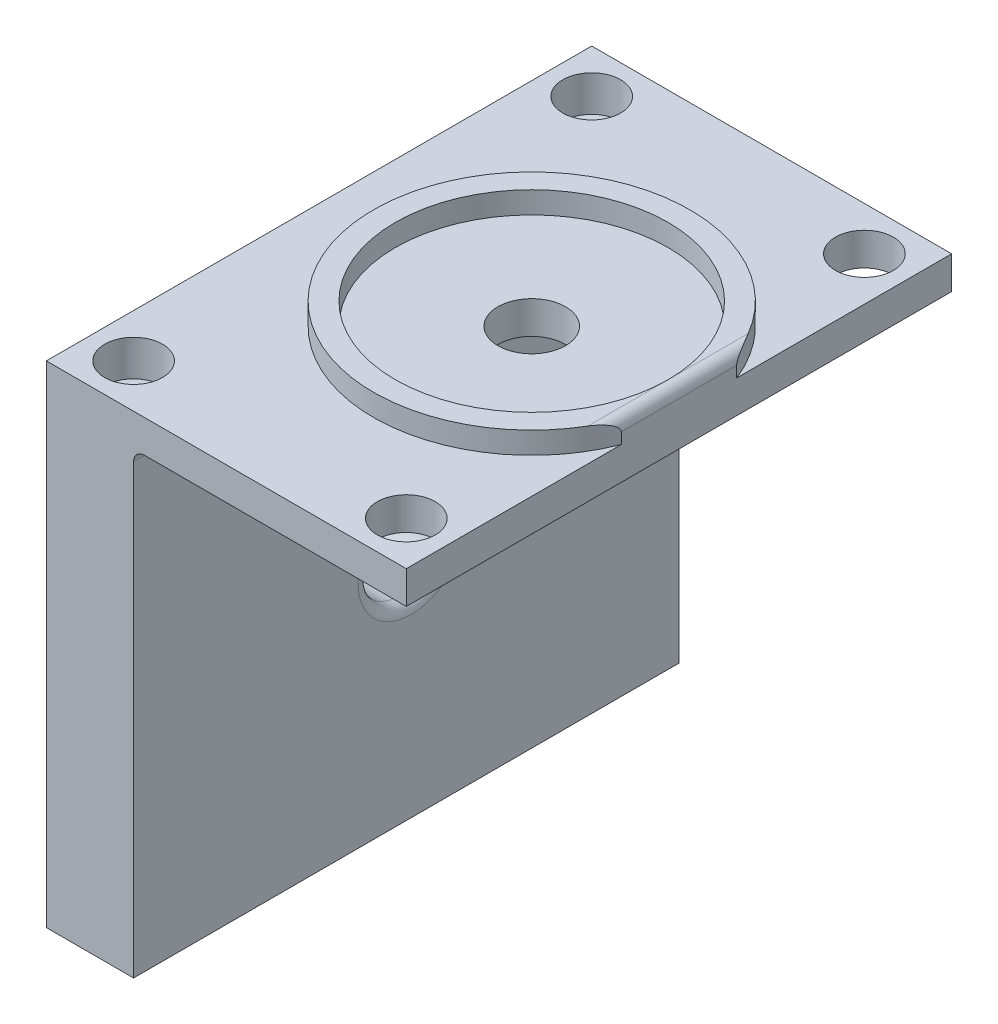
ISO-10303-21;
HEADER;
FILE_DESCRIPTION(('STEP AP214'),'2;1');
FILE_NAME('part.step','',(''),(''),'','','');
FILE_SCHEMA(('AUTOMOTIVE_DESIGN { 1 0 10303 214 1 1 1 1 }'));
ENDSEC;
DATA;
#1=APPLICATION_CONTEXT('core data for automotive mechanical design processes');
#2=APPLICATION_PROTOCOL_DEFINITION('international standard','automotive_design',2000,#1);
#3=PRODUCT_CONTEXT('',#1,'mechanical');
#4=PRODUCT('Part','Part','',(#3));
#5=PRODUCT_RELATED_PRODUCT_CATEGORY('part','',(#4));
#6=PRODUCT_DEFINITION_FORMATION('','',#4);
#7=PRODUCT_DEFINITION_CONTEXT('part definition',#1,'design');
#8=PRODUCT_DEFINITION('design','',#6,#7);
#9=PRODUCT_DEFINITION_SHAPE('','',#8);
#10=(LENGTH_UNIT() NAMED_UNIT(*) SI_UNIT(.MILLI.,.METRE.));
#11=(NAMED_UNIT(*) PLANE_ANGLE_UNIT() SI_UNIT($,.RADIAN.));
#12=(NAMED_UNIT(*) SI_UNIT($,.STERADIAN.) SOLID_ANGLE_UNIT());
#13=UNCERTAINTY_MEASURE_WITH_UNIT(LENGTH_MEASURE(1.E-05),#10,'distance_accuracy_value','');
#14=(GEOMETRIC_REPRESENTATION_CONTEXT(3) GLOBAL_UNCERTAINTY_ASSIGNED_CONTEXT((#13)) GLOBAL_UNIT_ASSIGNED_CONTEXT((#10,
#11,#12)) REPRESENTATION_CONTEXT('',''));
#15=CARTESIAN_POINT('',(0.,0.,0.));
#16=DIRECTION('',(0.,0.,1.));
#17=DIRECTION('',(1.,0.,0.));
#18=AXIS2_PLACEMENT_3D('',#15,#16,#17);
#19=CARTESIAN_POINT('',(0.,3.,0.));
#20=DIRECTION('',(0.,1.,0.));
#21=DIRECTION('',(0.,0.,1.));
#22=AXIS2_PLACEMENT_3D('',#19,#20,#21);
#23=PLANE('',#22);
#24=CARTESIAN_POINT('',(1.27695167286245,3.,-11.3847583643123));
#25=DIRECTION('',(0.,1.,0.));
#26=DIRECTION('',(0.,0.,1.));
#27=AXIS2_PLACEMENT_3D('',#24,#25,#26);
#28=CIRCLE('',#27,3.1);
#29=CARTESIAN_POINT('',(1.27695167286245,3.,-8.28475836431227));
#30=VERTEX_POINT('',#29);
#31=EDGE_CURVE('E244',#30,#30,#28,.T.);
#32=ORIENTED_EDGE('',*,*,#31,.F.);
#33=EDGE_LOOP('',(#32));
#34=FACE_BOUND('',#33,.T.);
#35=CARTESIAN_POINT('',(1.27695167286245,3.,-11.3847583643123));
#36=DIRECTION('',(0.,1.,0.));
#37=DIRECTION('',(0.,0.,1.));
#38=AXIS2_PLACEMENT_3D('',#35,#36,#37);
#39=CIRCLE('',#38,12.5);
#40=CARTESIAN_POINT('',(1.27695167286245,3.,1.11524163568773));
#41=VERTEX_POINT('',#40);
#42=EDGE_CURVE('E146',#41,#41,#39,.T.);
#43=ORIENTED_EDGE('',*,*,#42,.T.);
#44=EDGE_LOOP('',(#43));
#45=FACE_BOUND('',#44,.T.);
#46=ADVANCED_FACE('F41',(#34,#45),#23,.T.);
#47=CARTESIAN_POINT('',(0.,0.,0.));
#48=DIRECTION('',(0.,1.,0.));
#49=DIRECTION('',(0.,0.,1.));
#50=AXIS2_PLACEMENT_3D('',#47,#48,#49);
#51=PLANE('',#50);
#52=CARTESIAN_POINT('',(10.7769516728624,0.,-32.3847583643123));
#53=DIRECTION('',(0.,1.,0.));
#54=DIRECTION('',(0.,0.,1.));
#55=AXIS2_PLACEMENT_3D('',#52,#53,#54);
#56=CIRCLE('',#55,2.65);
#57=CARTESIAN_POINT('',(10.7769516728624,0.,-29.7347583643123));
#58=VERTEX_POINT('',#57);
#59=EDGE_CURVE('E170',#58,#58,#56,.F.);
#60=ORIENTED_EDGE('',*,*,#59,.F.);
#61=EDGE_LOOP('',(#60));
#62=FACE_BOUND('',#61,.T.);
#63=CARTESIAN_POINT('',(10.7769516728625,0.,9.61524163568773));
#64=DIRECTION('',(0.,1.,0.));
#65=DIRECTION('',(0.,0.,1.));
#66=AXIS2_PLACEMENT_3D('',#63,#64,#65);
#67=CIRCLE('',#66,2.65);
#68=CARTESIAN_POINT('',(10.7769516728625,0.,12.2652416356877));
#69=VERTEX_POINT('',#68);
#70=EDGE_CURVE('E163',#69,#69,#67,.F.);
#71=ORIENTED_EDGE('',*,*,#70,.F.);
#72=EDGE_LOOP('',(#71));
#73=FACE_BOUND('',#72,.T.);
#74=CARTESIAN_POINT('',(1.27695167286245,0.,-11.3847583643123));
#75=DIRECTION('',(0.,1.,0.));
#76=DIRECTION('',(0.,0.,1.));
#77=AXIS2_PLACEMENT_3D('',#74,#75,#76);
#78=CIRCLE('',#77,3.1);
#79=CARTESIAN_POINT('',(1.27695167286245,0.,-8.28475836431227));
#80=VERTEX_POINT('',#79);
#81=EDGE_CURVE('E243',#80,#80,#78,.T.);
#82=ORIENTED_EDGE('',*,*,#81,.T.);
#83=EDGE_LOOP('',(#82));
#84=FACE_BOUND('',#83,.T.);
#85=DIRECTION('',(1.,0.,0.));
#86=VECTOR('',#85,1.);
#87=CARTESIAN_POINT('',(-10.2230483271375,0.,13.6152416356877));
#88=LINE('',#87,#86);
#89=CARTESIAN_POINT('',(-9.22304832713755,0.,13.6152416356877));
#90=VERTEX_POINT('',#89);
#91=CARTESIAN_POINT('',(14.7769516728625,0.,13.6152416356877));
#92=VERTEX_POINT('',#91);
#93=EDGE_CURVE('E248',#90,#92,#88,.T.);
#94=ORIENTED_EDGE('',*,*,#93,.F.);
#95=DIRECTION('',(0.,0.,1.));
#96=VECTOR('',#95,1.);
#97=CARTESIAN_POINT('',(-9.22304832713755,0.,-36.3847583643123));
#98=LINE('',#97,#96);
#99=CARTESIAN_POINT('',(-9.22304832713755,0.,-36.3847583643123));
#100=VERTEX_POINT('',#99);
#101=EDGE_CURVE('E284',#90,#100,#98,.F.);
#102=ORIENTED_EDGE('',*,*,#101,.T.);
#103=DIRECTION('',(-1.,0.,0.));
#104=VECTOR('',#103,1.);
#105=CARTESIAN_POINT('',(-10.2230483271376,0.,-36.3847583643123));
#106=LINE('',#105,#104);
#107=CARTESIAN_POINT('',(14.7769516728625,0.,-36.3847583643123));
#108=VERTEX_POINT('',#107);
#109=EDGE_CURVE('E253',#108,#100,#106,.T.);
#110=ORIENTED_EDGE('',*,*,#109,.F.);
#111=DIRECTION('',(0.,0.,-1.));
#112=VECTOR('',#111,1.);
#113=CARTESIAN_POINT('',(14.7769516728625,0.,-36.3847583643123));
#114=LINE('',#113,#112);
#115=EDGE_CURVE('E260',#92,#108,#114,.T.);
#116=ORIENTED_EDGE('',*,*,#115,.F.);
#117=EDGE_LOOP('',(#94,#102,#110,#116));
#118=FACE_BOUND('',#117,.T.);
#119=ADVANCED_FACE('F386',(#62,#73,#84,#118),#51,.F.);
#120=CARTESIAN_POINT('',(1.27695167286245,3.,-11.3847583643123));
#121=DIRECTION('',(0.,1.,0.));
#122=DIRECTION('',(0.,0.,1.));
#123=AXIS2_PLACEMENT_3D('',#120,#121,#122);
#124=CIRCLE('',#123,14.5);
#125=CARTESIAN_POINT('',(14.7769516728625,3.,-16.6762609864415));
#126=VERTEX_POINT('',#125);
#127=CARTESIAN_POINT('',(14.7769516728625,3.,-6.0932557421831));
#128=VERTEX_POINT('',#127);
#129=EDGE_CURVE('E134',#126,#128,#124,.T.);
#130=ORIENTED_EDGE('',*,*,#129,.F.);
#131=DIRECTION('',(0.,0.,-1.));
#132=VECTOR('',#131,1.);
#133=CARTESIAN_POINT('',(14.7769516728625,3.,-36.3847583643123));
#134=LINE('',#133,#132);
#135=CARTESIAN_POINT('',(14.7769516728625,3.,-36.3847583643123));
#136=VERTEX_POINT('',#135);
#137=EDGE_CURVE('E141',#126,#136,#134,.T.);
#138=ORIENTED_EDGE('',*,*,#137,.T.);
#139=DIRECTION('',(-1.,0.,0.));
#140=VECTOR('',#139,1.);
#141=CARTESIAN_POINT('',(-10.2230483271376,3.,-36.3847583643123));
#142=LINE('',#141,#140);
#143=CARTESIAN_POINT('',(-18.2230483271376,3.,-36.3847583643123));
#144=VERTEX_POINT('',#143);
#145=EDGE_CURVE('E140',#136,#144,#142,.T.);
#146=ORIENTED_EDGE('',*,*,#145,.T.);
#147=DIRECTION('',(0.,0.,-1.));
#148=VECTOR('',#147,1.);
#149=CARTESIAN_POINT('',(-18.2230483271376,3.,-36.3847583643123));
#150=LINE('',#149,#148);
#151=CARTESIAN_POINT('',(-18.2230483271375,3.,13.6152416356877));
#152=VERTEX_POINT('',#151);
#153=EDGE_CURVE('E239',#152,#144,#150,.T.);
#154=ORIENTED_EDGE('',*,*,#153,.F.);
#155=DIRECTION('',(1.,0.,0.));
#156=VECTOR('',#155,1.);
#157=CARTESIAN_POINT('',(-10.2230483271375,3.,13.6152416356877));
#158=LINE('',#157,#156);
#159=CARTESIAN_POINT('',(14.7769516728625,3.,13.6152416356877));
#160=VERTEX_POINT('',#159);
#161=EDGE_CURVE('E137',#152,#160,#158,.T.);
#162=ORIENTED_EDGE('',*,*,#161,.T.);
#163=EDGE_CURVE('E123',#160,#128,#134,.T.);
#164=ORIENTED_EDGE('',*,*,#163,.T.);
#165=EDGE_LOOP('',(#130,#138,#146,#154,#162,#164));
#166=FACE_BOUND('',#165,.T.);
#167=CARTESIAN_POINT('',(10.7769516728624,3.,-32.3847583643123));
#168=DIRECTION('',(0.,-1.,0.));
#169=DIRECTION('',(0.,0.,1.));
#170=AXIS2_PLACEMENT_3D('',#167,#168,#169);
#171=CIRCLE('',#170,2.65);
#172=CARTESIAN_POINT('',(10.7769516728624,3.,-29.7347583643123));
#173=VERTEX_POINT('',#172);
#174=EDGE_CURVE('E159',#173,#173,#171,.T.);
#175=ORIENTED_EDGE('',*,*,#174,.T.);
#176=EDGE_LOOP('',(#175));
#177=FACE_BOUND('',#176,.T.);
#178=CARTESIAN_POINT('',(10.7769516728625,3.,9.61524163568773));
#179=DIRECTION('',(0.,-1.,0.));
#180=DIRECTION('',(0.,0.,1.));
#181=AXIS2_PLACEMENT_3D('',#178,#179,#180);
#182=CIRCLE('',#181,2.65);
#183=CARTESIAN_POINT('',(10.7769516728625,3.,12.2652416356877));
#184=VERTEX_POINT('',#183);
#185=EDGE_CURVE('E158',#184,#184,#182,.T.);
#186=ORIENTED_EDGE('',*,*,#185,.T.);
#187=EDGE_LOOP('',(#186));
#188=FACE_BOUND('',#187,.T.);
#189=CARTESIAN_POINT('',(-14.2230483271375,3.,-32.3847583643123));
#190=DIRECTION('',(0.,1.,0.));
#191=DIRECTION('',(0.,0.,1.));
#192=AXIS2_PLACEMENT_3D('',#189,#190,#191);
#193=CIRCLE('',#192,2.65);
#194=CARTESIAN_POINT('',(-14.2230483271375,3.,-29.7347583643123));
#195=VERTEX_POINT('',#194);
#196=EDGE_CURVE('E200',#195,#195,#193,.T.);
#197=ORIENTED_EDGE('',*,*,#196,.F.);
#198=EDGE_LOOP('',(#197));
#199=FACE_BOUND('',#198,.T.);
#200=CARTESIAN_POINT('',(-14.2230483271375,3.,9.61524163568773));
#201=DIRECTION('',(0.,1.,0.));
#202=DIRECTION('',(0.,0.,1.));
#203=AXIS2_PLACEMENT_3D('',#200,#201,#202);
#204=CIRCLE('',#203,2.65);
#205=CARTESIAN_POINT('',(-14.2230483271375,3.,12.2652416356877));
#206=VERTEX_POINT('',#205);
#207=EDGE_CURVE('E183',#206,#206,#204,.T.);
#208=ORIENTED_EDGE('',*,*,#207,.F.);
#209=EDGE_LOOP('',(#208));
#210=FACE_BOUND('',#209,.T.);
#211=ADVANCED_FACE('F132',(#166,#177,#188,#199,#210),#23,.T.);
#212=CARTESIAN_POINT('',(-10.2230483271375,3.,13.6152416356877));
#213=DIRECTION('',(0.,0.,-1.));
#214=DIRECTION('',(-1.,0.,0.));
#215=AXIS2_PLACEMENT_3D('',#212,#213,#214);
#216=PLANE('',#215);
#217=DIRECTION('',(0.,1.,0.));
#218=VECTOR('',#217,1.);
#219=CARTESIAN_POINT('',(-18.2230483271375,3.,13.6152416356877));
#220=LINE('',#219,#218);
#221=CARTESIAN_POINT('',(-18.2230483271376,-42.,13.6152416356877));
#222=VERTEX_POINT('',#221);
#223=EDGE_CURVE('E235',#222,#152,#220,.T.);
#224=ORIENTED_EDGE('',*,*,#223,.F.);
#225=DIRECTION('',(-1.,0.,0.));
#226=VECTOR('',#225,1.);
#227=CARTESIAN_POINT('',(-18.2230483271376,-42.,13.6152416356877));
#228=LINE('',#227,#226);
#229=CARTESIAN_POINT('',(-10.2230483271376,-42.,13.6152416356877));
#230=VERTEX_POINT('',#229);
#231=EDGE_CURVE('E220',#230,#222,#228,.T.);
#232=ORIENTED_EDGE('',*,*,#231,.F.);
#233=DIRECTION('',(0.,1.,0.));
#234=VECTOR('',#233,1.);
#235=CARTESIAN_POINT('',(-10.2230483271376,-42.,13.6152416356877));
#236=LINE('',#235,#234);
#237=CARTESIAN_POINT('',(-10.2230483271376,-1.00000000000001,13.6152416356877));
#238=VERTEX_POINT('',#237);
#239=EDGE_CURVE('E224',#230,#238,#236,.T.);
#240=ORIENTED_EDGE('',*,*,#239,.T.);
#241=CARTESIAN_POINT('',(-9.22304832713755,-1.,13.6152416356877));
#242=DIRECTION('',(0.,0.,-1.));
#243=DIRECTION('',(-1.,0.,0.));
#244=AXIS2_PLACEMENT_3D('',#241,#242,#243);
#245=CIRCLE('',#244,1.);
#246=EDGE_CURVE('E287',#238,#90,#245,.T.);
#247=ORIENTED_EDGE('',*,*,#246,.T.);
#248=ORIENTED_EDGE('',*,*,#93,.T.);
#249=DIRECTION('',(0.,-1.,0.));
#250=VECTOR('',#249,1.);
#251=CARTESIAN_POINT('',(14.7769516728625,3.,13.6152416356877));
#252=LINE('',#251,#250);
#253=EDGE_CURVE('E269',#160,#92,#252,.T.);
#254=ORIENTED_EDGE('',*,*,#253,.F.);
#255=ORIENTED_EDGE('',*,*,#161,.F.);
#256=EDGE_LOOP('',(#224,#232,#240,#247,#248,#254,#255));
#257=FACE_BOUND('',#256,.T.);
#258=ADVANCED_FACE('F385',(#257),#216,.F.);
#259=CARTESIAN_POINT('',(14.7769516728625,3.,-36.3847583643123));
#260=DIRECTION('',(-1.,0.,0.));
#261=DIRECTION('',(0.,0.,1.));
#262=AXIS2_PLACEMENT_3D('',#259,#260,#261);
#263=PLANE('',#262);
#264=DIRECTION('',(0.,-1.,0.));
#265=VECTOR('',#264,1.);
#266=CARTESIAN_POINT('',(14.7769516728625,5.,-16.6762609864414));
#267=LINE('',#266,#265);
#268=CARTESIAN_POINT('',(14.7769516728625,4.,-16.6762609864414));
#269=VERTEX_POINT('',#268);
#270=EDGE_CURVE('E127',#269,#126,#267,.T.);
#271=ORIENTED_EDGE('',*,*,#270,.F.);
#272=DIRECTION('',(0.,0.,-1.));
#273=VECTOR('',#272,1.);
#274=CARTESIAN_POINT('',(14.7769516728625,4.,-6.0932557421831));
#275=LINE('',#274,#273);
#276=CARTESIAN_POINT('',(14.7769516728625,4.,-6.0932557421831));
#277=VERTEX_POINT('',#276);
#278=EDGE_CURVE('E11',#269,#277,#275,.F.);
#279=ORIENTED_EDGE('',*,*,#278,.T.);
#280=DIRECTION('',(0.,-1.,0.));
#281=VECTOR('',#280,1.);
#282=CARTESIAN_POINT('',(14.7769516728625,5.,-6.0932557421831));
#283=LINE('',#282,#281);
#284=EDGE_CURVE('E119',#277,#128,#283,.T.);
#285=ORIENTED_EDGE('',*,*,#284,.T.);
#286=ORIENTED_EDGE('',*,*,#163,.F.);
#287=ORIENTED_EDGE('',*,*,#253,.T.);
#288=ORIENTED_EDGE('',*,*,#115,.T.);
#289=DIRECTION('',(0.,-1.,0.));
#290=VECTOR('',#289,1.);
#291=CARTESIAN_POINT('',(14.7769516728625,3.,-36.3847583643123));
#292=LINE('',#291,#290);
#293=EDGE_CURVE('E257',#136,#108,#292,.T.);
#294=ORIENTED_EDGE('',*,*,#293,.F.);
#295=ORIENTED_EDGE('',*,*,#137,.F.);
#296=EDGE_LOOP('',(#271,#279,#285,#286,#287,#288,#294,#295));
#297=FACE_BOUND('',#296,.T.);
#298=ADVANCED_FACE('F121',(#297),#263,.F.);
#299=CARTESIAN_POINT('',(-10.2230483271376,3.,-36.3847583643123));
#300=DIRECTION('',(0.,0.,1.));
#301=DIRECTION('',(1.,0.,0.));
#302=AXIS2_PLACEMENT_3D('',#299,#300,#301);
#303=PLANE('',#302);
#304=ORIENTED_EDGE('',*,*,#109,.T.);
#305=CARTESIAN_POINT('',(-9.22304832713755,-1.,-36.3847583643123));
#306=DIRECTION('',(0.,0.,1.));
#307=DIRECTION('',(1.,0.,0.));
#308=AXIS2_PLACEMENT_3D('',#305,#306,#307);
#309=CIRCLE('',#308,1.);
#310=CARTESIAN_POINT('',(-10.2230483271376,-1.00000000000001,-36.3847583643123));
#311=VERTEX_POINT('',#310);
#312=EDGE_CURVE('E290',#100,#311,#309,.T.);
#313=ORIENTED_EDGE('',*,*,#312,.T.);
#314=DIRECTION('',(0.,1.,0.));
#315=VECTOR('',#314,1.);
#316=CARTESIAN_POINT('',(-10.2230483271376,-42.,-36.3847583643123));
#317=LINE('',#316,#315);
#318=CARTESIAN_POINT('',(-10.2230483271376,-42.,-36.3847583643123));
#319=VERTEX_POINT('',#318);
#320=EDGE_CURVE('E228',#319,#311,#317,.T.);
#321=ORIENTED_EDGE('',*,*,#320,.F.);
#322=DIRECTION('',(1.,0.,0.));
#323=VECTOR('',#322,1.);
#324=CARTESIAN_POINT('',(-18.2230483271376,-42.,-36.3847583643123));
#325=LINE('',#324,#323);
#326=CARTESIAN_POINT('',(-18.2230483271376,-42.,-36.3847583643123));
#327=VERTEX_POINT('',#326);
#328=EDGE_CURVE('E214',#327,#319,#325,.T.);
#329=ORIENTED_EDGE('',*,*,#328,.F.);
#330=DIRECTION('',(0.,-1.,0.));
#331=VECTOR('',#330,1.);
#332=CARTESIAN_POINT('',(-18.2230483271376,3.,-36.3847583643123));
#333=LINE('',#332,#331);
#334=EDGE_CURVE('E232',#144,#327,#333,.T.);
#335=ORIENTED_EDGE('',*,*,#334,.F.);
#336=ORIENTED_EDGE('',*,*,#145,.F.);
#337=ORIENTED_EDGE('',*,*,#293,.T.);
#338=EDGE_LOOP('',(#304,#313,#321,#329,#335,#336,#337));
#339=FACE_BOUND('',#338,.T.);
#340=ADVANCED_FACE('F381',(#339),#303,.F.);
#341=CARTESIAN_POINT('',(1.27695167286245,3.,-11.3847583643123));
#342=DIRECTION('',(0.,-1.,0.));
#343=DIRECTION('',(0.,0.,-1.));
#344=AXIS2_PLACEMENT_3D('',#341,#342,#343);
#345=CYLINDRICAL_SURFACE('',#344,3.1);
#346=ORIENTED_EDGE('',*,*,#31,.T.);
#347=EDGE_LOOP('',(#346));
#348=FACE_BOUND('',#347,.T.);
#349=ORIENTED_EDGE('',*,*,#81,.F.);
#350=EDGE_LOOP('',(#349));
#351=FACE_BOUND('',#350,.T.);
#352=ADVANCED_FACE('F377',(#348,#351),#345,.F.);
#353=CARTESIAN_POINT('',(-18.2230483271375,0.,0.));
#354=DIRECTION('',(-1.,0.,0.));
#355=DIRECTION('',(0.,0.,1.));
#356=AXIS2_PLACEMENT_3D('',#353,#354,#355);
#357=PLANE('',#356);
#358=CARTESIAN_POINT('',(-18.2230483271375,-21.,-11.836279123996));
#359=DIRECTION('',(-1.,0.,0.));
#360=DIRECTION('',(0.,0.,1.));
#361=AXIS2_PLACEMENT_3D('',#358,#359,#360);
#362=CIRCLE('',#361,3.8682468035705);
#363=CARTESIAN_POINT('',(-18.2230483271375,-21.,-7.96803232042551));
#364=VERTEX_POINT('',#363);
#365=EDGE_CURVE('E174',#364,#364,#362,.T.);
#366=ORIENTED_EDGE('',*,*,#365,.F.);
#367=EDGE_LOOP('',(#366));
#368=FACE_BOUND('',#367,.T.);
#369=ORIENTED_EDGE('',*,*,#334,.T.);
#370=DIRECTION('',(0.,0.,-1.));
#371=VECTOR('',#370,1.);
#372=CARTESIAN_POINT('',(-18.2230483271376,-42.,-36.3847583643123));
#373=LINE('',#372,#371);
#374=EDGE_CURVE('E199',#222,#327,#373,.T.);
#375=ORIENTED_EDGE('',*,*,#374,.F.);
#376=ORIENTED_EDGE('',*,*,#223,.T.);
#377=ORIENTED_EDGE('',*,*,#153,.T.);
#378=EDGE_LOOP('',(#369,#375,#376,#377));
#379=FACE_BOUND('',#378,.T.);
#380=ADVANCED_FACE('F373',(#368,#379),#357,.T.);
#381=CARTESIAN_POINT('',(-10.2230483271376,-42.,-36.3847583643123));
#382=DIRECTION('',(-1.,0.,0.));
#383=DIRECTION('',(0.,0.,1.));
#384=AXIS2_PLACEMENT_3D('',#381,#382,#383);
#385=PLANE('',#384);
#386=CARTESIAN_POINT('',(-10.2230483271376,-21.,-11.836279123996));
#387=DIRECTION('',(-1.,0.,0.));
#388=DIRECTION('',(0.,0.,1.));
#389=AXIS2_PLACEMENT_3D('',#386,#387,#388);
#390=CIRCLE('',#389,4.86824680357049);
#391=CARTESIAN_POINT('',(-10.2230483271376,-21.,-6.96803232042551));
#392=VERTEX_POINT('',#391);
#393=EDGE_CURVE('E272',#392,#392,#390,.T.);
#394=ORIENTED_EDGE('',*,*,#393,.T.);
#395=EDGE_LOOP('',(#394));
#396=FACE_BOUND('',#395,.T.);
#397=ORIENTED_EDGE('',*,*,#320,.T.);
#398=DIRECTION('',(0.,0.,1.));
#399=VECTOR('',#398,1.);
#400=CARTESIAN_POINT('',(-10.2230483271376,-1.,13.6152416356877));
#401=LINE('',#400,#399);
#402=EDGE_CURVE('E280',#311,#238,#401,.T.);
#403=ORIENTED_EDGE('',*,*,#402,.T.);
#404=ORIENTED_EDGE('',*,*,#239,.F.);
#405=DIRECTION('',(0.,0.,1.));
#406=VECTOR('',#405,1.);
#407=CARTESIAN_POINT('',(-10.2230483271376,-42.,-36.3847583643123));
#408=LINE('',#407,#406);
#409=EDGE_CURVE('E217',#319,#230,#408,.T.);
#410=ORIENTED_EDGE('',*,*,#409,.F.);
#411=EDGE_LOOP('',(#397,#403,#404,#410));
#412=FACE_BOUND('',#411,.T.);
#413=ADVANCED_FACE('F369',(#396,#412),#385,.F.);
#414=CARTESIAN_POINT('',(0.,-42.,0.));
#415=DIRECTION('',(0.,1.,0.));
#416=DIRECTION('',(0.,0.,1.));
#417=AXIS2_PLACEMENT_3D('',#414,#415,#416);
#418=PLANE('',#417);
#419=CARTESIAN_POINT('',(-14.2230483271375,-42.,-32.3847583643123));
#420=DIRECTION('',(0.,1.,0.));
#421=DIRECTION('',(0.,0.,1.));
#422=AXIS2_PLACEMENT_3D('',#419,#420,#421);
#423=CIRCLE('',#422,2.65);
#424=CARTESIAN_POINT('',(-14.2230483271375,-42.,-29.7347583643123));
#425=VERTEX_POINT('',#424);
#426=EDGE_CURVE('E184',#425,#425,#423,.T.);
#427=ORIENTED_EDGE('',*,*,#426,.T.);
#428=EDGE_LOOP('',(#427));
#429=FACE_BOUND('',#428,.T.);
#430=CARTESIAN_POINT('',(-14.2230483271375,-42.,9.61524163568773));
#431=DIRECTION('',(0.,1.,0.));
#432=DIRECTION('',(0.,0.,1.));
#433=AXIS2_PLACEMENT_3D('',#430,#431,#432);
#434=CIRCLE('',#433,2.65);
#435=CARTESIAN_POINT('',(-14.2230483271375,-42.,12.2652416356877));
#436=VERTEX_POINT('',#435);
#437=EDGE_CURVE('E178',#436,#436,#434,.T.);
#438=ORIENTED_EDGE('',*,*,#437,.T.);
#439=EDGE_LOOP('',(#438));
#440=FACE_BOUND('',#439,.T.);
#441=ORIENTED_EDGE('',*,*,#374,.T.);
#442=ORIENTED_EDGE('',*,*,#328,.T.);
#443=ORIENTED_EDGE('',*,*,#409,.T.);
#444=ORIENTED_EDGE('',*,*,#231,.T.);
#445=EDGE_LOOP('',(#441,#442,#443,#444));
#446=FACE_BOUND('',#445,.T.);
#447=ADVANCED_FACE('F365',(#429,#440,#446),#418,.F.);
#448=CARTESIAN_POINT('',(-14.2230483271375,-0.3,9.61524163568773));
#449=DIRECTION('',(0.,1.,0.));
#450=DIRECTION('',(0.,0.,1.));
#451=AXIS2_PLACEMENT_3D('',#448,#449,#450);
#452=CYLINDRICAL_SURFACE('',#451,2.65);
#453=CARTESIAN_POINT('',(-14.2230483271375,-0.3,9.61524163568773));
#454=DIRECTION('',(0.,1.,0.));
#455=DIRECTION('',(0.,0.,1.));
#456=AXIS2_PLACEMENT_3D('',#453,#454,#455);
#457=CIRCLE('',#456,2.65);
#458=CARTESIAN_POINT('',(-14.2230483271375,-0.3,12.2652416356877));
#459=VERTEX_POINT('',#458);
#460=EDGE_CURVE('E204',#459,#459,#457,.T.);
#461=ORIENTED_EDGE('',*,*,#460,.F.);
#462=EDGE_LOOP('',(#461));
#463=FACE_BOUND('',#462,.T.);
#464=ORIENTED_EDGE('',*,*,#207,.T.);
#465=EDGE_LOOP('',(#464));
#466=FACE_BOUND('',#465,.T.);
#467=ADVANCED_FACE('F361',(#463,#466),#452,.F.);
#468=CARTESIAN_POINT('',(-14.2230483271375,-0.3,9.61524163568773));
#469=DIRECTION('',(0.,1.,0.));
#470=DIRECTION('',(0.,0.,1.));
#471=AXIS2_PLACEMENT_3D('',#468,#469,#470);
#472=PLANE('',#471);
#473=ORIENTED_EDGE('',*,*,#460,.T.);
#474=EDGE_LOOP('',(#473));
#475=FACE_BOUND('',#474,.T.);
#476=ADVANCED_FACE('F357',(#475),#472,.T.);
#477=CARTESIAN_POINT('',(-14.2230483271375,-0.3,-32.3847583643123));
#478=DIRECTION('',(0.,1.,0.));
#479=DIRECTION('',(0.,0.,1.));
#480=AXIS2_PLACEMENT_3D('',#477,#478,#479);
#481=CYLINDRICAL_SURFACE('',#480,2.65);
#482=CARTESIAN_POINT('',(-14.2230483271375,-0.3,-32.3847583643123));
#483=DIRECTION('',(0.,1.,0.));
#484=DIRECTION('',(0.,0.,1.));
#485=AXIS2_PLACEMENT_3D('',#482,#483,#484);
#486=CIRCLE('',#485,2.65);
#487=CARTESIAN_POINT('',(-14.2230483271375,-0.3,-29.7347583643123));
#488=VERTEX_POINT('',#487);
#489=EDGE_CURVE('E195',#488,#488,#486,.T.);
#490=ORIENTED_EDGE('',*,*,#489,.F.);
#491=EDGE_LOOP('',(#490));
#492=FACE_BOUND('',#491,.T.);
#493=ORIENTED_EDGE('',*,*,#196,.T.);
#494=EDGE_LOOP('',(#493));
#495=FACE_BOUND('',#494,.T.);
#496=ADVANCED_FACE('F353',(#492,#495),#481,.F.);
#497=CARTESIAN_POINT('',(-14.2230483271375,-0.3,-32.3847583643123));
#498=DIRECTION('',(0.,1.,0.));
#499=DIRECTION('',(0.,0.,1.));
#500=AXIS2_PLACEMENT_3D('',#497,#498,#499);
#501=PLANE('',#500);
#502=ORIENTED_EDGE('',*,*,#489,.T.);
#503=EDGE_LOOP('',(#502));
#504=FACE_BOUND('',#503,.T.);
#505=ADVANCED_FACE('F349',(#504),#501,.T.);
#506=CARTESIAN_POINT('',(-14.2230483271375,-38.7,9.61524163568773));
#507=DIRECTION('',(0.,-1.,0.));
#508=DIRECTION('',(0.,0.,-1.));
#509=AXIS2_PLACEMENT_3D('',#506,#507,#508);
#510=CYLINDRICAL_SURFACE('',#509,2.65);
#511=CARTESIAN_POINT('',(-14.2230483271375,-38.7,9.61524163568773));
#512=DIRECTION('',(0.,1.,0.));
#513=DIRECTION('',(0.,0.,1.));
#514=AXIS2_PLACEMENT_3D('',#511,#512,#513);
#515=CIRCLE('',#514,2.65);
#516=CARTESIAN_POINT('',(-14.2230483271375,-38.7,12.2652416356877));
#517=VERTEX_POINT('',#516);
#518=EDGE_CURVE('E188',#517,#517,#515,.T.);
#519=ORIENTED_EDGE('',*,*,#518,.T.);
#520=EDGE_LOOP('',(#519));
#521=FACE_BOUND('',#520,.T.);
#522=ORIENTED_EDGE('',*,*,#437,.F.);
#523=EDGE_LOOP('',(#522));
#524=FACE_BOUND('',#523,.T.);
#525=ADVANCED_FACE('F345',(#521,#524),#510,.F.);
#526=CARTESIAN_POINT('',(-14.2230483271375,-38.7,9.61524163568773));
#527=DIRECTION('',(0.,-1.,0.));
#528=DIRECTION('',(0.,0.,1.));
#529=AXIS2_PLACEMENT_3D('',#526,#527,#528);
#530=PLANE('',#529);
#531=ORIENTED_EDGE('',*,*,#518,.F.);
#532=EDGE_LOOP('',(#531));
#533=FACE_BOUND('',#532,.T.);
#534=ADVANCED_FACE('F341',(#533),#530,.T.);
#535=CARTESIAN_POINT('',(-14.2230483271375,-38.7,-32.3847583643123));
#536=DIRECTION('',(0.,-1.,0.));
#537=DIRECTION('',(0.,0.,-1.));
#538=AXIS2_PLACEMENT_3D('',#535,#536,#537);
#539=CYLINDRICAL_SURFACE('',#538,2.65);
#540=CARTESIAN_POINT('',(-14.2230483271375,-38.7,-32.3847583643123));
#541=DIRECTION('',(0.,1.,0.));
#542=DIRECTION('',(0.,0.,1.));
#543=AXIS2_PLACEMENT_3D('',#540,#541,#542);
#544=CIRCLE('',#543,2.65);
#545=CARTESIAN_POINT('',(-14.2230483271375,-38.7,-29.7347583643123));
#546=VERTEX_POINT('',#545);
#547=EDGE_CURVE('E179',#546,#546,#544,.T.);
#548=ORIENTED_EDGE('',*,*,#547,.T.);
#549=EDGE_LOOP('',(#548));
#550=FACE_BOUND('',#549,.T.);
#551=ORIENTED_EDGE('',*,*,#426,.F.);
#552=EDGE_LOOP('',(#551));
#553=FACE_BOUND('',#552,.T.);
#554=ADVANCED_FACE('F337',(#550,#553),#539,.F.);
#555=CARTESIAN_POINT('',(-14.2230483271375,-38.7,-32.3847583643123));
#556=DIRECTION('',(0.,-1.,0.));
#557=DIRECTION('',(0.,0.,1.));
#558=AXIS2_PLACEMENT_3D('',#555,#556,#557);
#559=PLANE('',#558);
#560=ORIENTED_EDGE('',*,*,#547,.F.);
#561=EDGE_LOOP('',(#560));
#562=FACE_BOUND('',#561,.T.);
#563=ADVANCED_FACE('F333',(#562),#559,.T.);
#564=CARTESIAN_POINT('',(-9.22304832713755,-21.,-11.836279123996));
#565=DIRECTION('',(-1.,0.,0.));
#566=DIRECTION('',(0.,0.,1.));
#567=AXIS2_PLACEMENT_3D('',#564,#565,#566);
#568=CYLINDRICAL_SURFACE('',#567,3.8682468035705);
#569=CARTESIAN_POINT('',(-11.2230483271376,-21.,-11.836279123996));
#570=DIRECTION('',(-1.,0.,0.));
#571=DIRECTION('',(0.,0.,1.));
#572=AXIS2_PLACEMENT_3D('',#569,#570,#571);
#573=CIRCLE('',#572,3.8682468035705);
#574=CARTESIAN_POINT('',(-11.2230483271376,-21.,-7.96803232042551));
#575=VERTEX_POINT('',#574);
#576=EDGE_CURVE('E276',#575,#575,#573,.F.);
#577=ORIENTED_EDGE('',*,*,#576,.T.);
#578=EDGE_LOOP('',(#577));
#579=FACE_BOUND('',#578,.T.);
#580=ORIENTED_EDGE('',*,*,#365,.T.);
#581=EDGE_LOOP('',(#580));
#582=FACE_BOUND('',#581,.T.);
#583=ADVANCED_FACE('F330',(#579,#582),#568,.F.);
#584=CARTESIAN_POINT('',(-11.2230483271376,-21.,-11.836279123996));
#585=DIRECTION('',(-1.,0.,0.));
#586=DIRECTION('',(0.,0.,1.));
#587=AXIS2_PLACEMENT_3D('',#584,#585,#586);
#588=TOROIDAL_SURFACE('',#587,4.86824680357049,1.);
#589=ORIENTED_EDGE('',*,*,#576,.F.);
#590=EDGE_LOOP('',(#589));
#591=FACE_BOUND('',#590,.T.);
#592=ORIENTED_EDGE('',*,*,#393,.F.);
#593=EDGE_LOOP('',(#592));
#594=FACE_BOUND('',#593,.T.);
#595=ADVANCED_FACE('F328',(#591,#594),#588,.T.);
#596=CARTESIAN_POINT('',(10.7769516728625,-0.3,9.61524163568773));
#597=DIRECTION('',(0.,1.,0.));
#598=DIRECTION('',(0.,0.,1.));
#599=AXIS2_PLACEMENT_3D('',#596,#597,#598);
#600=CYLINDRICAL_SURFACE('',#599,2.65);
#601=ORIENTED_EDGE('',*,*,#185,.F.);
#602=EDGE_LOOP('',(#601));
#603=FACE_BOUND('',#602,.T.);
#604=ORIENTED_EDGE('',*,*,#70,.T.);
#605=EDGE_LOOP('',(#604));
#606=FACE_BOUND('',#605,.T.);
#607=ADVANCED_FACE('F324',(#603,#606),#600,.F.);
#608=CARTESIAN_POINT('',(10.7769516728624,-0.3,-32.3847583643123));
#609=DIRECTION('',(0.,1.,0.));
#610=DIRECTION('',(0.,0.,1.));
#611=AXIS2_PLACEMENT_3D('',#608,#609,#610);
#612=CYLINDRICAL_SURFACE('',#611,2.65);
#613=ORIENTED_EDGE('',*,*,#174,.F.);
#614=EDGE_LOOP('',(#613));
#615=FACE_BOUND('',#614,.T.);
#616=ORIENTED_EDGE('',*,*,#59,.T.);
#617=EDGE_LOOP('',(#616));
#618=FACE_BOUND('',#617,.T.);
#619=ADVANCED_FACE('F320',(#615,#618),#612,.F.);
#620=CARTESIAN_POINT('',(1.27695167286245,5.,-11.3847583643123));
#621=DIRECTION('',(0.,-1.,0.));
#622=DIRECTION('',(0.,0.,-1.));
#623=AXIS2_PLACEMENT_3D('',#620,#621,#622);
#624=CYLINDRICAL_SURFACE('',#623,12.5);
#625=CARTESIAN_POINT('',(1.27695167286245,5.,-11.3847583643123));
#626=DIRECTION('',(0.,1.,0.));
#627=DIRECTION('',(0.,0.,1.));
#628=AXIS2_PLACEMENT_3D('',#625,#626,#627);
#629=CIRCLE('',#628,12.5);
#630=CARTESIAN_POINT('',(13.7769516728625,5.,-11.3847583643123));
#631=VERTEX_POINT('',#630);
#632=EDGE_CURVE('E145',#631,#631,#629,.T.);
#633=ORIENTED_EDGE('',*,*,#632,.T.);
#634=EDGE_LOOP('',(#633));
#635=FACE_BOUND('',#634,.T.);
#636=ORIENTED_EDGE('',*,*,#42,.F.);
#637=EDGE_LOOP('',(#636));
#638=FACE_BOUND('',#637,.T.);
#639=ADVANCED_FACE('F316',(#635,#638),#624,.F.);
#640=CARTESIAN_POINT('',(1.27695167286245,5.,-11.3847583643123));
#641=DIRECTION('',(0.,-1.,0.));
#642=DIRECTION('',(0.,0.,-1.));
#643=AXIS2_PLACEMENT_3D('',#640,#641,#642);
#644=CYLINDRICAL_SURFACE('',#643,14.5);
#645=CARTESIAN_POINT('',(1.27695167286245,5.,-11.3847583643123));
#646=DIRECTION('',(0.,1.,0.));
#647=DIRECTION('',(0.,0.,1.));
#648=AXIS2_PLACEMENT_3D('',#645,#646,#647);
#649=CIRCLE('',#648,14.5);
#650=CARTESIAN_POINT('',(13.7769516728625,5.,-18.7332275926618));
#651=VERTEX_POINT('',#650);
#652=CARTESIAN_POINT('',(13.7769516728625,5.,-4.03628913596274));
#653=VERTEX_POINT('',#652);
#654=EDGE_CURVE('E128',#651,#653,#649,.T.);
#655=ORIENTED_EDGE('',*,*,#654,.F.);
#656=CARTESIAN_POINT('',(13.7769516728625,5.,-18.7332275926618));
#657=CARTESIAN_POINT('',(13.8061141464169,4.99999449154705,-18.6836220816922));
#658=CARTESIAN_POINT('',(13.8349743998542,4.99872509822277,-18.6338528371027));
#659=CARTESIAN_POINT('',(13.8920474592475,4.99376830957608,-18.5340702030511));
#660=CARTESIAN_POINT('',(13.9202603324725,4.99008116666869,-18.4840568396163));
#661=CARTESIAN_POINT('',(14.0039674818749,4.97554080477307,-18.3335890674113));
#662=CARTESIAN_POINT('',(14.0584305613203,4.96120940560983,-18.2328766730217));
#663=CARTESIAN_POINT('',(14.1640438597545,4.92373430222118,-18.0319895928188));
#664=CARTESIAN_POINT('',(14.2152082150977,4.9006315957957,-17.931814571518));
#665=CARTESIAN_POINT('',(14.3141920717866,4.84533681639526,-17.7324126512781));
#666=CARTESIAN_POINT('',(14.3620152554512,4.8131549532352,-17.6331848160426));
#667=CARTESIAN_POINT('',(14.4345864725353,4.75411377500788,-17.4782461415));
#668=CARTESIAN_POINT('',(14.4605760429363,4.73071365055245,-17.4217946043335));
#669=CARTESIAN_POINT('',(14.5112269097921,4.67980424014433,-17.3099368184038));
#670=CARTESIAN_POINT('',(14.5358843928176,4.65228392806517,-17.2545338380622));
#671=CARTESIAN_POINT('',(14.5867754720504,4.5882938751465,-17.1382885222535));
#672=CARTESIAN_POINT('',(14.6127754710012,4.55111843120913,-17.0777159573401));
#673=CARTESIAN_POINT('',(14.6495380714809,4.48904145383137,-16.9905531043374));
#674=CARTESIAN_POINT('',(14.6614026075625,4.46733555878338,-16.9621562287386));
#675=CARTESIAN_POINT('',(14.6842017760944,4.42137552493057,-16.9071242592913));
#676=CARTESIAN_POINT('',(14.6951375389787,4.3971245665991,-16.8804870327681));
#677=CARTESIAN_POINT('',(14.7137404021336,4.35060508438718,-16.8348219269034));
#678=CARTESIAN_POINT('',(14.7216271093777,4.32888654646072,-16.8153285303678));
#679=CARTESIAN_POINT('',(14.7363398664156,4.28311157134351,-16.7787602542757));
#680=CARTESIAN_POINT('',(14.7431657578184,4.2590547858975,-16.7616857359169));
#681=CARTESIAN_POINT('',(14.7544656411555,4.21204547507311,-16.7332924663767));
#682=CARTESIAN_POINT('',(14.7591367466656,4.18943250249642,-16.7214989815994));
#683=CARTESIAN_POINT('',(14.7670337261866,4.14247473277496,-16.7015057211644));
#684=CARTESIAN_POINT('',(14.770265286082,4.11813719715745,-16.6932918098324));
#685=CARTESIAN_POINT('',(14.7740205323601,4.07801141975203,-16.6837344909193));
#686=CARTESIAN_POINT('',(14.7751091438234,4.06261244947122,-16.6809599960088));
#687=CARTESIAN_POINT('',(14.7765794768407,4.03148342085064,-16.6772105785968));
#688=CARTESIAN_POINT('',(14.7769574391643,4.01575204448508,-16.6762452262832));
#689=CARTESIAN_POINT('',(14.7769516728625,4.,-16.6762609864415));
#690=B_SPLINE_CURVE_WITH_KNOTS('',3,(#656,#657,#658,#659,#660,#661,#662,#663,#664,#665,#666,
#667,#668,#669,#670,#671,#672,#673,#674,#675,#676,#677,#678,#679,#680,#681,#682,#683,#684,#685,
#686,#687,#688,#689),.UNSPECIFIED.,.F.,.F.,(4,2,2,2,2,2,2,2,2,2,2,2,2,2,2,2,4),(0.,
0.172591972021019,0.345165928168248,0.690902412869367,1.03504240457597,1.37879693146951,
1.57789337126309,1.77753246996147,2.00400424412499,2.11688868383973,2.22963369886568,
2.32017732693708,2.41073446117226,2.4882556487197,2.56546786944276,2.61240709679239,
2.65959393476005),.UNSPECIFIED.);
#691=EDGE_CURVE('E51',#651,#269,#690,.T.);
#692=ORIENTED_EDGE('',*,*,#691,.T.);
#693=ORIENTED_EDGE('',*,*,#270,.T.);
#694=ORIENTED_EDGE('',*,*,#129,.T.);
#695=ORIENTED_EDGE('',*,*,#284,.F.);
#696=CARTESIAN_POINT('',(14.7769516728625,4.,-6.0932557421831));
#697=CARTESIAN_POINT('',(14.7769772268781,4.02350137926755,-6.0933253457501));
#698=CARTESIAN_POINT('',(14.7761245369859,4.04689712884393,-6.09114523279819));
#699=CARTESIAN_POINT('',(14.7729095541436,4.0925797638675,-6.0829519297892));
#700=CARTESIAN_POINT('',(14.7705683580581,4.11487752684814,-6.07699231028391));
#701=CARTESIAN_POINT('',(14.7638023841443,4.16402631895078,-6.05982105418627));
#702=CARTESIAN_POINT('',(14.7589844088894,4.19046919885614,-6.04762259383998));
#703=CARTESIAN_POINT('',(14.7478122949384,4.24104853581303,-6.01948601002841));
#704=CARTESIAN_POINT('',(14.7414491074889,4.2651701931195,-6.00352587504192));
#705=CARTESIAN_POINT('',(14.722462946641,4.3282906800881,-5.95619857204768));
#706=CARTESIAN_POINT('',(14.7087118757404,4.36496061208386,-5.9222210940931));
#707=CARTESIAN_POINT('',(14.6791623516264,4.43288071938175,-5.85011386744499));
#708=CARTESIAN_POINT('',(14.6633592988266,4.46411833846059,-5.81197482208334));
#709=CARTESIAN_POINT('',(14.6284001619487,4.52576580833244,-5.72869182803872));
#710=CARTESIAN_POINT('',(14.6090675996237,4.55566387165214,-5.68324747695123));
#711=CARTESIAN_POINT('',(14.5690174419888,4.61139817187735,-5.5904896328336));
#712=CARTESIAN_POINT('',(14.5482983029443,4.63722977048067,-5.54317408131173));
#713=CARTESIAN_POINT('',(14.5056169853978,4.68563234796344,-5.44715052325133));
#714=CARTESIAN_POINT('',(14.4836496012932,4.70818802677986,-5.39843718002356));
#715=CARTESIAN_POINT('',(14.4387015637644,4.75035596299977,-5.30024860797619));
#716=CARTESIAN_POINT('',(14.4157212544486,4.76996921017851,-5.25077364155396));
#717=CARTESIAN_POINT('',(14.3465394321655,4.82398277921941,-5.10404558899946));
#718=CARTESIAN_POINT('',(14.2990179752593,4.85472934921626,-5.00605550999555));
#719=CARTESIAN_POINT('',(14.2007685752387,4.90745819681814,-4.80926711882019));
#720=CARTESIAN_POINT('',(14.1500377668094,4.92943251086848,-4.71046815497575));
#721=CARTESIAN_POINT('',(14.0469220561388,4.96436796073481,-4.51528017564261));
#722=CARTESIAN_POINT('',(13.9946080826665,4.97753663788144,-4.41889139249576));
#723=CARTESIAN_POINT('',(13.9142953183201,4.99089361039555,-4.27486621080745));
#724=CARTESIAN_POINT('',(13.8872370705327,4.994279788987,-4.22698423607917));
#725=CARTESIAN_POINT('',(13.8325287326456,4.99883075611543,-4.13144763494774));
#726=CARTESIAN_POINT('',(13.8048785823979,4.99999531780171,-4.08379303225722));
#727=CARTESIAN_POINT('',(13.7769516728625,5.,-4.03628913596274));
#728=B_SPLINE_CURVE_WITH_KNOTS('',3,(#696,#697,#698,#699,#700,#701,#702,#703,#704,#705,#706,
#707,#708,#709,#710,#711,#712,#713,#714,#715,#716,#717,#718,#719,#720,#721,#722,#723,#724,#725,
#726,#727),.UNSPECIFIED.,.F.,.F.,(4,2,2,2,2,2,2,2,2,2,2,2,2,2,2,4),(0.,0.070218129096379,
0.139462578570901,0.22751370170692,0.316093442474373,0.470767009714158,0.625793469473668,
0.798715125043626,0.971832611785286,1.14573428943534,1.31957733823649,1.65857528356152,
1.99788027907682,2.32887621199646,2.49414228993346,2.65942524238999),.UNSPECIFIED.);
#729=EDGE_CURVE('E300',#277,#653,#728,.T.);
#730=ORIENTED_EDGE('',*,*,#729,.T.);
#731=EDGE_LOOP('',(#655,#692,#693,#694,#695,#730));
#732=FACE_BOUND('',#731,.T.);
#733=ADVANCED_FACE('F143',(#732),#644,.T.);
#734=CARTESIAN_POINT('',(0.,5.,0.));
#735=DIRECTION('',(0.,1.,0.));
#736=DIRECTION('',(0.,0.,1.));
#737=AXIS2_PLACEMENT_3D('',#734,#735,#736);
#738=PLANE('',#737);
#739=ORIENTED_EDGE('',*,*,#654,.T.);
#740=DIRECTION('',(0.,0.,-1.));
#741=VECTOR('',#740,1.);
#742=CARTESIAN_POINT('',(13.7769516728625,5.,-16.6762609864414));
#743=LINE('',#742,#741);
#744=EDGE_CURVE('E296',#653,#631,#743,.T.);
#745=ORIENTED_EDGE('',*,*,#744,.T.);
#746=ORIENTED_EDGE('',*,*,#632,.F.);
#747=DIRECTION('',(0.,0.,-1.));
#748=VECTOR('',#747,1.);
#749=CARTESIAN_POINT('',(13.7769516728625,5.,-16.6762609864414));
#750=LINE('',#749,#748);
#751=EDGE_CURVE('E293',#631,#651,#750,.T.);
#752=ORIENTED_EDGE('',*,*,#751,.T.);
#753=EDGE_LOOP('',(#739,#745,#746,#752));
#754=FACE_BOUND('',#753,.T.);
#755=ADVANCED_FACE('F315',(#754),#738,.T.);
#756=CARTESIAN_POINT('',(-9.22304832713755,-1.,-36.3847583643123));
#757=DIRECTION('',(0.,0.,-1.));
#758=DIRECTION('',(-1.,0.,0.));
#759=AXIS2_PLACEMENT_3D('',#756,#757,#758);
#760=CYLINDRICAL_SURFACE('',#759,1.);
#761=ORIENTED_EDGE('',*,*,#312,.F.);
#762=ORIENTED_EDGE('',*,*,#101,.F.);
#763=ORIENTED_EDGE('',*,*,#246,.F.);
#764=ORIENTED_EDGE('',*,*,#402,.F.);
#765=EDGE_LOOP('',(#761,#762,#763,#764));
#766=FACE_BOUND('',#765,.T.);
#767=ADVANCED_FACE('F400',(#766),#760,.F.);
#768=CARTESIAN_POINT('',(13.7769516728625,4.,0.));
#769=DIRECTION('',(0.,0.,1.));
#770=DIRECTION('',(1.,0.,0.));
#771=AXIS2_PLACEMENT_3D('',#768,#769,#770);
#772=CYLINDRICAL_SURFACE('',#771,1.);
#773=ORIENTED_EDGE('',*,*,#729,.F.);
#774=ORIENTED_EDGE('',*,*,#278,.F.);
#775=ORIENTED_EDGE('',*,*,#691,.F.);
#776=ORIENTED_EDGE('',*,*,#751,.F.);
#777=ORIENTED_EDGE('',*,*,#744,.F.);
#778=EDGE_LOOP('',(#773,#774,#775,#776,#777));
#779=FACE_BOUND('',#778,.T.);
#780=ADVANCED_FACE('F43',(#779),#772,.T.);
#781=CLOSED_SHELL('',(#46,#119,#211,#258,#298,#340,#352,#380,#413,#447,#467,#476,#496,#505,#525,
#534,#554,#563,#583,#595,#607,#619,#639,#733,#755,#767,#780));
#782=MANIFOLD_SOLID_BREP('B2',#781);
#783=ADVANCED_BREP_SHAPE_REPRESENTATION('',(#18,#782),#14);
#784=SHAPE_DEFINITION_REPRESENTATION(#9,#783);
ENDSEC;
END-ISO-10303-21;
